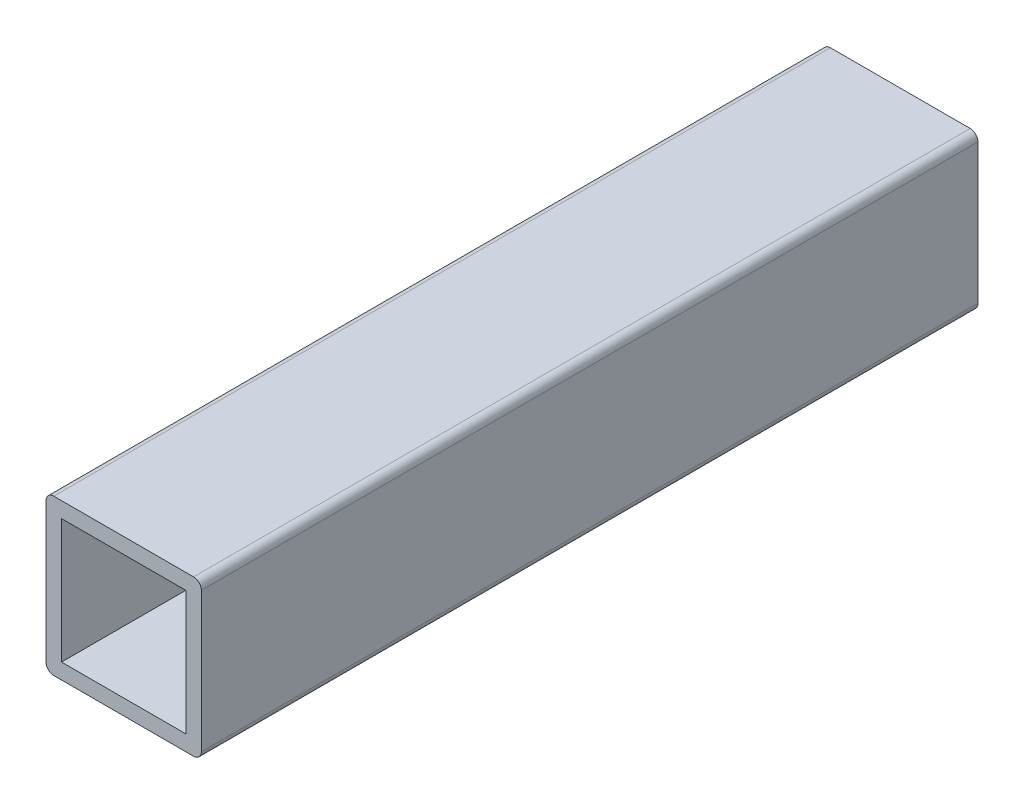
ISO-10303-21;
HEADER;
FILE_DESCRIPTION(('STEP AP214'),'2;1');
FILE_NAME('part.step','',(''),(''),'','','');
FILE_SCHEMA(('AUTOMOTIVE_DESIGN { 1 0 10303 214 1 1 1 1 }'));
ENDSEC;
DATA;
#1=APPLICATION_CONTEXT('core data for automotive mechanical design processes');
#2=APPLICATION_PROTOCOL_DEFINITION('international standard','automotive_design',2000,#1);
#3=PRODUCT_CONTEXT('',#1,'mechanical');
#4=PRODUCT('Part','Part','',(#3));
#5=PRODUCT_RELATED_PRODUCT_CATEGORY('part','',(#4));
#6=PRODUCT_DEFINITION_FORMATION('','',#4);
#7=PRODUCT_DEFINITION_CONTEXT('part definition',#1,'design');
#8=PRODUCT_DEFINITION('design','',#6,#7);
#9=PRODUCT_DEFINITION_SHAPE('','',#8);
#10=(LENGTH_UNIT() NAMED_UNIT(*) SI_UNIT(.MILLI.,.METRE.));
#11=(NAMED_UNIT(*) PLANE_ANGLE_UNIT() SI_UNIT($,.RADIAN.));
#12=(NAMED_UNIT(*) SI_UNIT($,.STERADIAN.) SOLID_ANGLE_UNIT());
#13=UNCERTAINTY_MEASURE_WITH_UNIT(LENGTH_MEASURE(1.E-05),#10,'distance_accuracy_value','');
#14=(GEOMETRIC_REPRESENTATION_CONTEXT(3) GLOBAL_UNCERTAINTY_ASSIGNED_CONTEXT((#13)) GLOBAL_UNIT_ASSIGNED_CONTEXT((#10,
#11,#12)) REPRESENTATION_CONTEXT('',''));
#15=CARTESIAN_POINT('',(0.,0.,0.));
#16=DIRECTION('',(0.,0.,1.));
#17=DIRECTION('',(1.,0.,0.));
#18=AXIS2_PLACEMENT_3D('',#15,#16,#17);
#19=CARTESIAN_POINT('',(15.875,-15.875,914.4));
#20=DIRECTION('',(-1.,0.,0.));
#21=DIRECTION('',(0.,0.,1.));
#22=AXIS2_PLACEMENT_3D('',#19,#20,#21);
#23=PLANE('',#22);
#24=DIRECTION('',(0.,1.,0.));
#25=VECTOR('',#24,1.);
#26=CARTESIAN_POINT('',(15.875,14.2875,-755.65));
#27=LINE('',#26,#25);
#28=CARTESIAN_POINT('',(15.875,-14.2875,-755.65));
#29=VERTEX_POINT('',#28);
#30=CARTESIAN_POINT('',(15.875,14.2875,-755.65));
#31=VERTEX_POINT('',#30);
#32=EDGE_CURVE('E60',#29,#31,#27,.T.);
#33=ORIENTED_EDGE('',*,*,#32,.F.);
#34=DIRECTION('',(0.,0.,-1.));
#35=VECTOR('',#34,1.);
#36=CARTESIAN_POINT('',(15.875,-14.2875,914.4));
#37=LINE('',#36,#35);
#38=CARTESIAN_POINT('',(15.875,-14.2875,-914.4));
#39=VERTEX_POINT('',#38);
#40=EDGE_CURVE('E11',#29,#39,#37,.T.);
#41=ORIENTED_EDGE('',*,*,#40,.T.);
#42=DIRECTION('',(0.,1.,0.));
#43=VECTOR('',#42,1.);
#44=CARTESIAN_POINT('',(15.875,-15.875,-914.4));
#45=LINE('',#44,#43);
#46=CARTESIAN_POINT('',(15.875,14.2875,-914.4));
#47=VERTEX_POINT('',#46);
#48=EDGE_CURVE('E180',#39,#47,#45,.T.);
#49=ORIENTED_EDGE('',*,*,#48,.T.);
#50=DIRECTION('',(0.,0.,-1.));
#51=VECTOR('',#50,1.);
#52=CARTESIAN_POINT('',(15.875,14.2875,914.4));
#53=LINE('',#52,#51);
#54=EDGE_CURVE('E45',#47,#31,#53,.F.);
#55=ORIENTED_EDGE('',*,*,#54,.T.);
#56=EDGE_LOOP('',(#33,#41,#49,#55));
#57=FACE_BOUND('',#56,.T.);
#58=ADVANCED_FACE('F37',(#57),#23,.F.);
#59=CARTESIAN_POINT('',(-15.875,15.875,914.4));
#60=DIRECTION('',(0.,-1.,0.));
#61=DIRECTION('',(0.,0.,-1.));
#62=AXIS2_PLACEMENT_3D('',#59,#60,#61);
#63=PLANE('',#62);
#64=DIRECTION('',(-1.,0.,0.));
#65=VECTOR('',#64,1.);
#66=CARTESIAN_POINT('',(-14.2875,15.875,-755.65));
#67=LINE('',#66,#65);
#68=CARTESIAN_POINT('',(14.2875,15.875,-755.65));
#69=VERTEX_POINT('',#68);
#70=CARTESIAN_POINT('',(-14.2875,15.875,-755.65));
#71=VERTEX_POINT('',#70);
#72=EDGE_CURVE('E187',#69,#71,#67,.T.);
#73=ORIENTED_EDGE('',*,*,#72,.F.);
#74=DIRECTION('',(0.,0.,-1.));
#75=VECTOR('',#74,1.);
#76=CARTESIAN_POINT('',(14.2875,15.875,914.4));
#77=LINE('',#76,#75);
#78=CARTESIAN_POINT('',(14.2875,15.875,-914.4));
#79=VERTEX_POINT('',#78);
#80=EDGE_CURVE('E165',#69,#79,#77,.T.);
#81=ORIENTED_EDGE('',*,*,#80,.T.);
#82=DIRECTION('',(-1.,0.,0.));
#83=VECTOR('',#82,1.);
#84=CARTESIAN_POINT('',(-15.875,15.875,-914.4));
#85=LINE('',#84,#83);
#86=CARTESIAN_POINT('',(-14.2875,15.875,-914.4));
#87=VERTEX_POINT('',#86);
#88=EDGE_CURVE('E204',#79,#87,#85,.T.);
#89=ORIENTED_EDGE('',*,*,#88,.T.);
#90=DIRECTION('',(0.,0.,-1.));
#91=VECTOR('',#90,1.);
#92=CARTESIAN_POINT('',(-14.2875,15.875,914.4));
#93=LINE('',#92,#91);
#94=EDGE_CURVE('E167',#87,#71,#93,.F.);
#95=ORIENTED_EDGE('',*,*,#94,.T.);
#96=EDGE_LOOP('',(#73,#81,#89,#95));
#97=FACE_BOUND('',#96,.T.);
#98=ADVANCED_FACE('F254',(#97),#63,.F.);
#99=CARTESIAN_POINT('',(-15.875,-15.875,914.4));
#100=DIRECTION('',(1.,0.,0.));
#101=DIRECTION('',(0.,0.,-1.));
#102=AXIS2_PLACEMENT_3D('',#99,#100,#101);
#103=PLANE('',#102);
#104=DIRECTION('',(0.,-1.,0.));
#105=VECTOR('',#104,1.);
#106=CARTESIAN_POINT('',(-15.875,14.2875,-755.65));
#107=LINE('',#106,#105);
#108=CARTESIAN_POINT('',(-15.875,14.2875,-755.65));
#109=VERTEX_POINT('',#108);
#110=CARTESIAN_POINT('',(-15.875,-14.2875,-755.65));
#111=VERTEX_POINT('',#110);
#112=EDGE_CURVE('E240',#109,#111,#107,.T.);
#113=ORIENTED_EDGE('',*,*,#112,.F.);
#114=DIRECTION('',(0.,0.,-1.));
#115=VECTOR('',#114,1.);
#116=CARTESIAN_POINT('',(-15.875,14.2875,914.4));
#117=LINE('',#116,#115);
#118=CARTESIAN_POINT('',(-15.875,14.2875,-914.4));
#119=VERTEX_POINT('',#118);
#120=EDGE_CURVE('E155',#109,#119,#117,.T.);
#121=ORIENTED_EDGE('',*,*,#120,.T.);
#122=DIRECTION('',(0.,-1.,0.));
#123=VECTOR('',#122,1.);
#124=CARTESIAN_POINT('',(-15.875,-15.875,-914.4));
#125=LINE('',#124,#123);
#126=CARTESIAN_POINT('',(-15.875,-14.2875,-914.4));
#127=VERTEX_POINT('',#126);
#128=EDGE_CURVE('E207',#119,#127,#125,.T.);
#129=ORIENTED_EDGE('',*,*,#128,.T.);
#130=DIRECTION('',(0.,0.,-1.));
#131=VECTOR('',#130,1.);
#132=CARTESIAN_POINT('',(-15.875,-14.2875,914.4));
#133=LINE('',#132,#131);
#134=EDGE_CURVE('E147',#127,#111,#133,.F.);
#135=ORIENTED_EDGE('',*,*,#134,.T.);
#136=EDGE_LOOP('',(#113,#121,#129,#135));
#137=FACE_BOUND('',#136,.T.);
#138=ADVANCED_FACE('F231',(#137),#103,.F.);
#139=CARTESIAN_POINT('',(-15.875,-15.875,914.4));
#140=DIRECTION('',(0.,1.,0.));
#141=DIRECTION('',(0.,0.,1.));
#142=AXIS2_PLACEMENT_3D('',#139,#140,#141);
#143=PLANE('',#142);
#144=DIRECTION('',(1.,0.,0.));
#145=VECTOR('',#144,1.);
#146=CARTESIAN_POINT('',(-14.2875,-15.875,-755.65));
#147=LINE('',#146,#145);
#148=CARTESIAN_POINT('',(-14.2875,-15.875,-755.65));
#149=VERTEX_POINT('',#148);
#150=CARTESIAN_POINT('',(14.2875,-15.875,-755.65));
#151=VERTEX_POINT('',#150);
#152=EDGE_CURVE('E239',#149,#151,#147,.T.);
#153=ORIENTED_EDGE('',*,*,#152,.F.);
#154=DIRECTION('',(0.,0.,-1.));
#155=VECTOR('',#154,1.);
#156=CARTESIAN_POINT('',(-14.2875,-15.875,914.4));
#157=LINE('',#156,#155);
#158=CARTESIAN_POINT('',(-14.2875,-15.875,-914.4));
#159=VERTEX_POINT('',#158);
#160=EDGE_CURVE('E173',#149,#159,#157,.T.);
#161=ORIENTED_EDGE('',*,*,#160,.T.);
#162=DIRECTION('',(1.,0.,0.));
#163=VECTOR('',#162,1.);
#164=CARTESIAN_POINT('',(-15.875,-15.875,-914.4));
#165=LINE('',#164,#163);
#166=CARTESIAN_POINT('',(14.2875,-15.875,-914.4));
#167=VERTEX_POINT('',#166);
#168=EDGE_CURVE('E210',#159,#167,#165,.T.);
#169=ORIENTED_EDGE('',*,*,#168,.T.);
#170=DIRECTION('',(0.,0.,-1.));
#171=VECTOR('',#170,1.);
#172=CARTESIAN_POINT('',(14.2875,-15.875,914.4));
#173=LINE('',#172,#171);
#174=EDGE_CURVE('E170',#167,#151,#173,.F.);
#175=ORIENTED_EDGE('',*,*,#174,.T.);
#176=EDGE_LOOP('',(#153,#161,#169,#175));
#177=FACE_BOUND('',#176,.T.);
#178=ADVANCED_FACE('F251',(#177),#143,.F.);
#179=CARTESIAN_POINT('',(-12.7,-12.7,914.4));
#180=DIRECTION('',(0.,1.,0.));
#181=DIRECTION('',(0.,0.,1.));
#182=AXIS2_PLACEMENT_3D('',#179,#180,#181);
#183=PLANE('',#182);
#184=DIRECTION('',(0.,0.,-1.));
#185=VECTOR('',#184,1.);
#186=CARTESIAN_POINT('',(-12.7,-12.7,914.4));
#187=LINE('',#186,#185);
#188=CARTESIAN_POINT('',(-12.7,-12.7,-755.65));
#189=VERTEX_POINT('',#188);
#190=CARTESIAN_POINT('',(-12.7,-12.7,-914.4));
#191=VERTEX_POINT('',#190);
#192=EDGE_CURVE('E149',#189,#191,#187,.T.);
#193=ORIENTED_EDGE('',*,*,#192,.F.);
#194=DIRECTION('',(1.,0.,0.));
#195=VECTOR('',#194,1.);
#196=CARTESIAN_POINT('',(-12.7,-12.7,-755.65));
#197=LINE('',#196,#195);
#198=CARTESIAN_POINT('',(12.7,-12.7,-755.65));
#199=VERTEX_POINT('',#198);
#200=EDGE_CURVE('E52',#189,#199,#197,.T.);
#201=ORIENTED_EDGE('',*,*,#200,.T.);
#202=DIRECTION('',(0.,0.,-1.));
#203=VECTOR('',#202,1.);
#204=CARTESIAN_POINT('',(12.7,-12.7,914.4));
#205=LINE('',#204,#203);
#206=CARTESIAN_POINT('',(12.7,-12.7,-914.4));
#207=VERTEX_POINT('',#206);
#208=EDGE_CURVE('E139',#199,#207,#205,.T.);
#209=ORIENTED_EDGE('',*,*,#208,.T.);
#210=DIRECTION('',(1.,0.,0.));
#211=VECTOR('',#210,1.);
#212=CARTESIAN_POINT('',(-12.7,-12.7,-914.4));
#213=LINE('',#212,#211);
#214=EDGE_CURVE('E189',#191,#207,#213,.T.);
#215=ORIENTED_EDGE('',*,*,#214,.F.);
#216=EDGE_LOOP('',(#193,#201,#209,#215));
#217=FACE_BOUND('',#216,.T.);
#218=ADVANCED_FACE('F218',(#217),#183,.T.);
#219=CARTESIAN_POINT('',(12.7,-12.7,914.4));
#220=DIRECTION('',(-1.,0.,0.));
#221=DIRECTION('',(0.,0.,1.));
#222=AXIS2_PLACEMENT_3D('',#219,#220,#221);
#223=PLANE('',#222);
#224=ORIENTED_EDGE('',*,*,#208,.F.);
#225=DIRECTION('',(0.,1.,0.));
#226=VECTOR('',#225,1.);
#227=CARTESIAN_POINT('',(12.7,12.7,-755.65));
#228=LINE('',#227,#226);
#229=CARTESIAN_POINT('',(12.7,12.7,-755.65));
#230=VERTEX_POINT('',#229);
#231=EDGE_CURVE('E126',#199,#230,#228,.T.);
#232=ORIENTED_EDGE('',*,*,#231,.T.);
#233=DIRECTION('',(0.,0.,-1.));
#234=VECTOR('',#233,1.);
#235=CARTESIAN_POINT('',(12.7,12.7,914.4));
#236=LINE('',#235,#234);
#237=CARTESIAN_POINT('',(12.7,12.7,-914.4));
#238=VERTEX_POINT('',#237);
#239=EDGE_CURVE('E137',#230,#238,#236,.T.);
#240=ORIENTED_EDGE('',*,*,#239,.T.);
#241=DIRECTION('',(0.,1.,0.));
#242=VECTOR('',#241,1.);
#243=CARTESIAN_POINT('',(12.7,-12.7,-914.4));
#244=LINE('',#243,#242);
#245=EDGE_CURVE('E197',#207,#238,#244,.T.);
#246=ORIENTED_EDGE('',*,*,#245,.F.);
#247=EDGE_LOOP('',(#224,#232,#240,#246));
#248=FACE_BOUND('',#247,.T.);
#249=ADVANCED_FACE('F135',(#248),#223,.T.);
#250=CARTESIAN_POINT('',(-12.7,12.7,914.4));
#251=DIRECTION('',(0.,-1.,0.));
#252=DIRECTION('',(0.,0.,-1.));
#253=AXIS2_PLACEMENT_3D('',#250,#251,#252);
#254=PLANE('',#253);
#255=ORIENTED_EDGE('',*,*,#239,.F.);
#256=DIRECTION('',(-1.,0.,0.));
#257=VECTOR('',#256,1.);
#258=CARTESIAN_POINT('',(-12.7,12.7,-755.65));
#259=LINE('',#258,#257);
#260=CARTESIAN_POINT('',(-12.7,12.7,-755.65));
#261=VERTEX_POINT('',#260);
#262=EDGE_CURVE('E123',#230,#261,#259,.T.);
#263=ORIENTED_EDGE('',*,*,#262,.T.);
#264=DIRECTION('',(0.,0.,-1.));
#265=VECTOR('',#264,1.);
#266=CARTESIAN_POINT('',(-12.7,12.7,914.4));
#267=LINE('',#266,#265);
#268=CARTESIAN_POINT('',(-12.7,12.7,-914.4));
#269=VERTEX_POINT('',#268);
#270=EDGE_CURVE('E145',#261,#269,#267,.T.);
#271=ORIENTED_EDGE('',*,*,#270,.T.);
#272=DIRECTION('',(-1.,0.,0.));
#273=VECTOR('',#272,1.);
#274=CARTESIAN_POINT('',(-12.7,12.7,-914.4));
#275=LINE('',#274,#273);
#276=EDGE_CURVE('E143',#238,#269,#275,.T.);
#277=ORIENTED_EDGE('',*,*,#276,.F.);
#278=EDGE_LOOP('',(#255,#263,#271,#277));
#279=FACE_BOUND('',#278,.T.);
#280=ADVANCED_FACE('F141',(#279),#254,.T.);
#281=CARTESIAN_POINT('',(-12.7,-12.7,914.4));
#282=DIRECTION('',(1.,0.,0.));
#283=DIRECTION('',(0.,0.,-1.));
#284=AXIS2_PLACEMENT_3D('',#281,#282,#283);
#285=PLANE('',#284);
#286=ORIENTED_EDGE('',*,*,#270,.F.);
#287=DIRECTION('',(0.,-1.,0.));
#288=VECTOR('',#287,1.);
#289=CARTESIAN_POINT('',(-12.7,12.7,-755.65));
#290=LINE('',#289,#288);
#291=EDGE_CURVE('E127',#261,#189,#290,.T.);
#292=ORIENTED_EDGE('',*,*,#291,.T.);
#293=ORIENTED_EDGE('',*,*,#192,.T.);
#294=DIRECTION('',(0.,-1.,0.));
#295=VECTOR('',#294,1.);
#296=CARTESIAN_POINT('',(-12.7,-12.7,-914.4));
#297=LINE('',#296,#295);
#298=EDGE_CURVE('E200',#269,#191,#297,.T.);
#299=ORIENTED_EDGE('',*,*,#298,.F.);
#300=EDGE_LOOP('',(#286,#292,#293,#299));
#301=FACE_BOUND('',#300,.T.);
#302=ADVANCED_FACE('F216',(#301),#285,.T.);
#303=CARTESIAN_POINT('',(-14.2875,14.2875,914.4));
#304=DIRECTION('',(0.,0.,-1.));
#305=DIRECTION('',(-1.,0.,0.));
#306=AXIS2_PLACEMENT_3D('',#303,#304,#305);
#307=CYLINDRICAL_SURFACE('',#306,1.5875);
#308=ORIENTED_EDGE('',*,*,#120,.F.);
#309=CARTESIAN_POINT('',(-14.2875,14.2875,-755.65));
#310=DIRECTION('',(0.,0.,1.));
#311=DIRECTION('',(1.,0.,0.));
#312=AXIS2_PLACEMENT_3D('',#309,#310,#311);
#313=CIRCLE('',#312,1.5875);
#314=EDGE_CURVE('E131',#71,#109,#313,.T.);
#315=ORIENTED_EDGE('',*,*,#314,.F.);
#316=ORIENTED_EDGE('',*,*,#94,.F.);
#317=CARTESIAN_POINT('',(-14.2875,14.2875,-914.4));
#318=DIRECTION('',(0.,0.,-1.));
#319=DIRECTION('',(-1.,0.,0.));
#320=AXIS2_PLACEMENT_3D('',#317,#318,#319);
#321=CIRCLE('',#320,1.5875);
#322=EDGE_CURVE('E163',#119,#87,#321,.T.);
#323=ORIENTED_EDGE('',*,*,#322,.F.);
#324=EDGE_LOOP('',(#308,#315,#316,#323));
#325=FACE_BOUND('',#324,.T.);
#326=ADVANCED_FACE('F257',(#325),#307,.T.);
#327=CARTESIAN_POINT('',(-14.2875,-14.2875,914.4));
#328=DIRECTION('',(0.,0.,-1.));
#329=DIRECTION('',(-1.,0.,0.));
#330=AXIS2_PLACEMENT_3D('',#327,#328,#329);
#331=CYLINDRICAL_SURFACE('',#330,1.5875);
#332=ORIENTED_EDGE('',*,*,#160,.F.);
#333=CARTESIAN_POINT('',(-14.2875,-14.2875,-755.65));
#334=DIRECTION('',(0.,0.,1.));
#335=DIRECTION('',(1.,0.,0.));
#336=AXIS2_PLACEMENT_3D('',#333,#334,#335);
#337=CIRCLE('',#336,1.5875);
#338=EDGE_CURVE('E237',#111,#149,#337,.T.);
#339=ORIENTED_EDGE('',*,*,#338,.F.);
#340=ORIENTED_EDGE('',*,*,#134,.F.);
#341=CARTESIAN_POINT('',(-14.2875,-14.2875,-914.4));
#342=DIRECTION('',(0.,0.,-1.));
#343=DIRECTION('',(-1.,0.,0.));
#344=AXIS2_PLACEMENT_3D('',#341,#342,#343);
#345=CIRCLE('',#344,1.5875);
#346=EDGE_CURVE('E161',#159,#127,#345,.T.);
#347=ORIENTED_EDGE('',*,*,#346,.F.);
#348=EDGE_LOOP('',(#332,#339,#340,#347));
#349=FACE_BOUND('',#348,.T.);
#350=ADVANCED_FACE('F236',(#349),#331,.T.);
#351=CARTESIAN_POINT('',(14.2875,-14.2875,914.4));
#352=DIRECTION('',(0.,0.,-1.));
#353=DIRECTION('',(-1.,0.,0.));
#354=AXIS2_PLACEMENT_3D('',#351,#352,#353);
#355=CYLINDRICAL_SURFACE('',#354,1.5875);
#356=ORIENTED_EDGE('',*,*,#40,.F.);
#357=CARTESIAN_POINT('',(14.2875,-14.2875,-755.65));
#358=DIRECTION('',(0.,0.,1.));
#359=DIRECTION('',(-1.,0.,0.));
#360=AXIS2_PLACEMENT_3D('',#357,#358,#359);
#361=CIRCLE('',#360,1.58750000000001);
#362=EDGE_CURVE('E191',#151,#29,#361,.T.);
#363=ORIENTED_EDGE('',*,*,#362,.F.);
#364=ORIENTED_EDGE('',*,*,#174,.F.);
#365=CARTESIAN_POINT('',(14.2875,-14.2875,-914.4));
#366=DIRECTION('',(0.,0.,-1.));
#367=DIRECTION('',(-1.,0.,0.));
#368=AXIS2_PLACEMENT_3D('',#365,#366,#367);
#369=CIRCLE('',#368,1.5875);
#370=EDGE_CURVE('E159',#39,#167,#369,.T.);
#371=ORIENTED_EDGE('',*,*,#370,.F.);
#372=EDGE_LOOP('',(#356,#363,#364,#371));
#373=FACE_BOUND('',#372,.T.);
#374=ADVANCED_FACE('F248',(#373),#355,.T.);
#375=CARTESIAN_POINT('',(14.2875,14.2875,914.4));
#376=DIRECTION('',(0.,0.,-1.));
#377=DIRECTION('',(-1.,0.,0.));
#378=AXIS2_PLACEMENT_3D('',#375,#376,#377);
#379=CYLINDRICAL_SURFACE('',#378,1.5875);
#380=ORIENTED_EDGE('',*,*,#80,.F.);
#381=CARTESIAN_POINT('',(14.2875,14.2875,-755.65));
#382=DIRECTION('',(0.,0.,1.));
#383=DIRECTION('',(-1.,0.,0.));
#384=AXIS2_PLACEMENT_3D('',#381,#382,#383);
#385=CIRCLE('',#384,1.5875);
#386=EDGE_CURVE('E185',#31,#69,#385,.T.);
#387=ORIENTED_EDGE('',*,*,#386,.F.);
#388=ORIENTED_EDGE('',*,*,#54,.F.);
#389=CARTESIAN_POINT('',(14.2875,14.2875,-914.4));
#390=DIRECTION('',(0.,0.,-1.));
#391=DIRECTION('',(-1.,0.,0.));
#392=AXIS2_PLACEMENT_3D('',#389,#390,#391);
#393=CIRCLE('',#392,1.5875);
#394=EDGE_CURVE('E157',#79,#47,#393,.T.);
#395=ORIENTED_EDGE('',*,*,#394,.F.);
#396=EDGE_LOOP('',(#380,#387,#388,#395));
#397=FACE_BOUND('',#396,.T.);
#398=ADVANCED_FACE('F39',(#397),#379,.T.);
#399=CARTESIAN_POINT('',(0.,0.,-914.4));
#400=DIRECTION('',(0.,0.,-1.));
#401=DIRECTION('',(-1.,0.,0.));
#402=AXIS2_PLACEMENT_3D('',#399,#400,#401);
#403=PLANE('',#402);
#404=ORIENTED_EDGE('',*,*,#214,.T.);
#405=ORIENTED_EDGE('',*,*,#245,.T.);
#406=ORIENTED_EDGE('',*,*,#276,.T.);
#407=ORIENTED_EDGE('',*,*,#298,.T.);
#408=EDGE_LOOP('',(#404,#405,#406,#407));
#409=FACE_BOUND('',#408,.T.);
#410=ORIENTED_EDGE('',*,*,#128,.F.);
#411=ORIENTED_EDGE('',*,*,#322,.T.);
#412=ORIENTED_EDGE('',*,*,#88,.F.);
#413=ORIENTED_EDGE('',*,*,#394,.T.);
#414=ORIENTED_EDGE('',*,*,#48,.F.);
#415=ORIENTED_EDGE('',*,*,#370,.T.);
#416=ORIENTED_EDGE('',*,*,#168,.F.);
#417=ORIENTED_EDGE('',*,*,#346,.T.);
#418=EDGE_LOOP('',(#410,#411,#412,#413,#414,#415,#416,#417));
#419=FACE_BOUND('',#418,.T.);
#420=ADVANCED_FACE('F220',(#409,#419),#403,.T.);
#421=CARTESIAN_POINT('',(-14.2875,14.2875,-755.65));
#422=DIRECTION('',(0.,0.,1.));
#423=DIRECTION('',(1.,0.,0.));
#424=AXIS2_PLACEMENT_3D('',#421,#422,#423);
#425=PLANE('',#424);
#426=ORIENTED_EDGE('',*,*,#262,.F.);
#427=ORIENTED_EDGE('',*,*,#231,.F.);
#428=ORIENTED_EDGE('',*,*,#200,.F.);
#429=ORIENTED_EDGE('',*,*,#291,.F.);
#430=EDGE_LOOP('',(#426,#427,#428,#429));
#431=FACE_BOUND('',#430,.T.);
#432=ORIENTED_EDGE('',*,*,#314,.T.);
#433=ORIENTED_EDGE('',*,*,#112,.T.);
#434=ORIENTED_EDGE('',*,*,#338,.T.);
#435=ORIENTED_EDGE('',*,*,#152,.T.);
#436=ORIENTED_EDGE('',*,*,#362,.T.);
#437=ORIENTED_EDGE('',*,*,#32,.T.);
#438=ORIENTED_EDGE('',*,*,#386,.T.);
#439=ORIENTED_EDGE('',*,*,#72,.T.);
#440=EDGE_LOOP('',(#432,#433,#434,#435,#436,#437,#438,#439));
#441=FACE_BOUND('',#440,.T.);
#442=ADVANCED_FACE('F125',(#431,#441),#425,.T.);
#443=CLOSED_SHELL('',(#58,#98,#138,#178,#218,#249,#280,#302,#326,#350,#374,#398,#420,#442));
#444=MANIFOLD_SOLID_BREP('B2',#443);
#445=ADVANCED_BREP_SHAPE_REPRESENTATION('',(#18,#444),#14);
#446=SHAPE_DEFINITION_REPRESENTATION(#9,#445);
ENDSEC;
END-ISO-10303-21;
